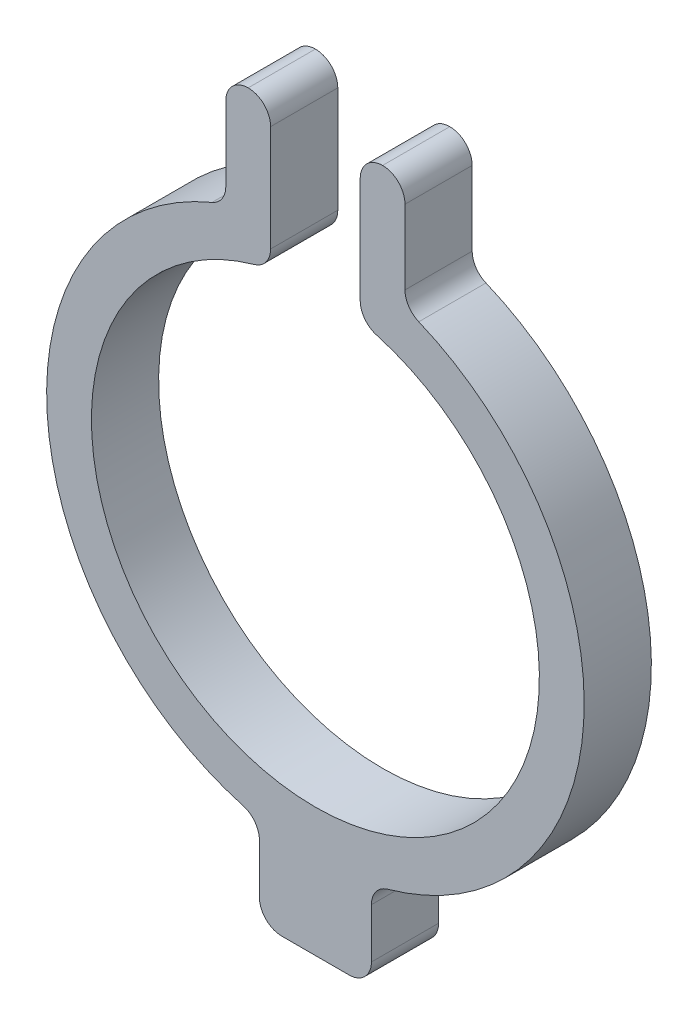
ISO-10303-21;
HEADER;
FILE_DESCRIPTION(('STEP AP214'),'2;1');
FILE_NAME('part.step','',(''),(''),'','','');
FILE_SCHEMA(('AUTOMOTIVE_DESIGN { 1 0 10303 214 1 1 1 1 }'));
ENDSEC;
DATA;
#1=APPLICATION_CONTEXT('core data for automotive mechanical design processes');
#2=APPLICATION_PROTOCOL_DEFINITION('international standard','automotive_design',2000,#1);
#3=PRODUCT_CONTEXT('',#1,'mechanical');
#4=PRODUCT('Part','Part','',(#3));
#5=PRODUCT_RELATED_PRODUCT_CATEGORY('part','',(#4));
#6=PRODUCT_DEFINITION_FORMATION('','',#4);
#7=PRODUCT_DEFINITION_CONTEXT('part definition',#1,'design');
#8=PRODUCT_DEFINITION('design','',#6,#7);
#9=PRODUCT_DEFINITION_SHAPE('','',#8);
#10=(LENGTH_UNIT() NAMED_UNIT(*) SI_UNIT(.MILLI.,.METRE.));
#11=(NAMED_UNIT(*) PLANE_ANGLE_UNIT() SI_UNIT($,.RADIAN.));
#12=(NAMED_UNIT(*) SI_UNIT($,.STERADIAN.) SOLID_ANGLE_UNIT());
#13=UNCERTAINTY_MEASURE_WITH_UNIT(LENGTH_MEASURE(1.E-05),#10,'distance_accuracy_value','');
#14=(GEOMETRIC_REPRESENTATION_CONTEXT(3) GLOBAL_UNCERTAINTY_ASSIGNED_CONTEXT((#13)) GLOBAL_UNIT_ASSIGNED_CONTEXT((#10,
#11,#12)) REPRESENTATION_CONTEXT('',''));
#15=CARTESIAN_POINT('',(0.,0.,0.));
#16=DIRECTION('',(0.,0.,1.));
#17=DIRECTION('',(1.,0.,0.));
#18=AXIS2_PLACEMENT_3D('',#15,#16,#17);
#19=CARTESIAN_POINT('',(5.00000000000001,0.,6.));
#20=DIRECTION('',(1.,0.,0.));
#21=DIRECTION('',(0.,1.,0.));
#22=AXIS2_PLACEMENT_3D('',#19,#20,#21);
#23=PLANE('',#22);
#24=DIRECTION('',(0.,-1.,0.));
#25=VECTOR('',#24,1.);
#26=CARTESIAN_POINT('',(5.00000000000001,0.,6.));
#27=LINE('',#26,#25);
#28=CARTESIAN_POINT('',(5.00000000000002,-25.0399680510978,6.));
#29=VERTEX_POINT('',#28);
#30=CARTESIAN_POINT('',(5.00000000000002,-29.473389188611,6.));
#31=VERTEX_POINT('',#30);
#32=EDGE_CURVE('E212',#29,#31,#27,.T.);
#33=ORIENTED_EDGE('',*,*,#32,.T.);
#34=DIRECTION('',(0.,0.,-1.));
#35=VECTOR('',#34,1.);
#36=CARTESIAN_POINT('',(5.00000000000002,-29.473389188611,0.));
#37=LINE('',#36,#35);
#38=CARTESIAN_POINT('',(5.00000000000002,-29.473389188611,0.));
#39=VERTEX_POINT('',#38);
#40=EDGE_CURVE('E260',#31,#39,#37,.T.);
#41=ORIENTED_EDGE('',*,*,#40,.T.);
#42=DIRECTION('',(0.,-1.,0.));
#43=VECTOR('',#42,1.);
#44=CARTESIAN_POINT('',(5.00000000000001,0.,0.));
#45=LINE('',#44,#43);
#46=CARTESIAN_POINT('',(5.00000000000002,-25.0399680510978,0.));
#47=VERTEX_POINT('',#46);
#48=EDGE_CURVE('E307',#47,#39,#45,.T.);
#49=ORIENTED_EDGE('',*,*,#48,.F.);
#50=DIRECTION('',(0.,0.,-1.));
#51=VECTOR('',#50,1.);
#52=CARTESIAN_POINT('',(5.00000000000002,-25.0399680510978,6.));
#53=LINE('',#52,#51);
#54=EDGE_CURVE('E258',#47,#29,#53,.F.);
#55=ORIENTED_EDGE('',*,*,#54,.T.);
#56=EDGE_LOOP('',(#33,#41,#49,#55));
#57=FACE_BOUND('',#56,.T.);
#58=ADVANCED_FACE('F35',(#57),#23,.T.);
#59=CARTESIAN_POINT('',(0.,0.,6.));
#60=DIRECTION('',(0.,0.,-1.));
#61=DIRECTION('',(-1.,0.,0.));
#62=AXIS2_PLACEMENT_3D('',#59,#60,#61);
#63=CYLINDRICAL_SURFACE('',#62,24.);
#64=CARTESIAN_POINT('',(0.,0.,6.));
#65=DIRECTION('',(0.,0.,1.));
#66=DIRECTION('',(1.,0.,0.));
#67=AXIS2_PLACEMENT_3D('',#64,#65,#66);
#68=CIRCLE('',#67,24.);
#69=CARTESIAN_POINT('',(6.46153846153848,-23.1138166625518,6.));
#70=VERTEX_POINT('',#69);
#71=CARTESIAN_POINT('',(9.23076923076922,22.1538461538462,6.));
#72=VERTEX_POINT('',#71);
#73=EDGE_CURVE('E216',#70,#72,#68,.T.);
#74=ORIENTED_EDGE('',*,*,#73,.F.);
#75=DIRECTION('',(0.,0.,-1.));
#76=VECTOR('',#75,1.);
#77=CARTESIAN_POINT('',(6.46153846153848,-23.1138166625518,6.));
#78=LINE('',#77,#76);
#79=CARTESIAN_POINT('',(6.46153846153848,-23.1138166625518,0.));
#80=VERTEX_POINT('',#79);
#81=EDGE_CURVE('E265',#70,#80,#78,.T.);
#82=ORIENTED_EDGE('',*,*,#81,.T.);
#83=CARTESIAN_POINT('',(0.,0.,0.));
#84=DIRECTION('',(0.,0.,1.));
#85=DIRECTION('',(1.,0.,0.));
#86=AXIS2_PLACEMENT_3D('',#83,#84,#85);
#87=CIRCLE('',#86,24.);
#88=CARTESIAN_POINT('',(9.23076923076922,22.1538461538462,0.));
#89=VERTEX_POINT('',#88);
#90=EDGE_CURVE('E311',#80,#89,#87,.T.);
#91=ORIENTED_EDGE('',*,*,#90,.T.);
#92=DIRECTION('',(0.,0.,-1.));
#93=VECTOR('',#92,1.);
#94=CARTESIAN_POINT('',(9.23076923076922,22.1538461538462,6.));
#95=LINE('',#94,#93);
#96=EDGE_CURVE('E263',#89,#72,#95,.F.);
#97=ORIENTED_EDGE('',*,*,#96,.T.);
#98=EDGE_LOOP('',(#74,#82,#91,#97));
#99=FACE_BOUND('',#98,.T.);
#100=ADVANCED_FACE('F379',(#99),#63,.T.);
#101=CARTESIAN_POINT('',(8.,0.,6.));
#102=DIRECTION('',(-1.,0.,0.));
#103=DIRECTION('',(0.,-1.,0.));
#104=AXIS2_PLACEMENT_3D('',#101,#102,#103);
#105=PLANE('',#104);
#106=DIRECTION('',(0.,1.,0.));
#107=VECTOR('',#106,1.);
#108=CARTESIAN_POINT('',(8.,0.,6.));
#109=LINE('',#108,#107);
#110=CARTESIAN_POINT('',(7.99999999999999,24.,6.));
#111=VERTEX_POINT('',#110);
#112=CARTESIAN_POINT('',(7.99999999999999,30.6274169979695,6.));
#113=VERTEX_POINT('',#112);
#114=EDGE_CURVE('E440',#111,#113,#109,.T.);
#115=ORIENTED_EDGE('',*,*,#114,.F.);
#116=DIRECTION('',(0.,0.,1.));
#117=VECTOR('',#116,1.);
#118=CARTESIAN_POINT('',(7.99999999999999,24.,0.));
#119=LINE('',#118,#117);
#120=CARTESIAN_POINT('',(7.99999999999999,24.,0.));
#121=VERTEX_POINT('',#120);
#122=EDGE_CURVE('E271',#111,#121,#119,.F.);
#123=ORIENTED_EDGE('',*,*,#122,.T.);
#124=DIRECTION('',(0.,1.,0.));
#125=VECTOR('',#124,1.);
#126=CARTESIAN_POINT('',(8.,0.,0.));
#127=LINE('',#126,#125);
#128=CARTESIAN_POINT('',(7.99999999999999,30.6274169979695,0.));
#129=VERTEX_POINT('',#128);
#130=EDGE_CURVE('E347',#121,#129,#127,.T.);
#131=ORIENTED_EDGE('',*,*,#130,.T.);
#132=DIRECTION('',(0.,0.,-1.));
#133=VECTOR('',#132,1.);
#134=CARTESIAN_POINT('',(7.99999999999999,30.6274169979695,6.));
#135=LINE('',#134,#133);
#136=EDGE_CURVE('E268',#129,#113,#135,.F.);
#137=ORIENTED_EDGE('',*,*,#136,.T.);
#138=EDGE_LOOP('',(#115,#123,#131,#137));
#139=FACE_BOUND('',#138,.T.);
#140=ADVANCED_FACE('F385',(#139),#105,.F.);
#141=CARTESIAN_POINT('',(4.00000000000001,0.,6.));
#142=DIRECTION('',(-1.,0.,0.));
#143=DIRECTION('',(0.,-1.,0.));
#144=AXIS2_PLACEMENT_3D('',#141,#142,#143);
#145=PLANE('',#144);
#146=DIRECTION('',(0.,1.,0.));
#147=VECTOR('',#146,1.);
#148=CARTESIAN_POINT('',(4.00000000000001,0.,6.));
#149=LINE('',#148,#147);
#150=CARTESIAN_POINT('',(4.,21.1660104885167,6.));
#151=VERTEX_POINT('',#150);
#152=CARTESIAN_POINT('',(3.99999999999999,30.6274169979695,6.));
#153=VERTEX_POINT('',#152);
#154=EDGE_CURVE('E435',#151,#153,#149,.T.);
#155=ORIENTED_EDGE('',*,*,#154,.T.);
#156=DIRECTION('',(0.,0.,-1.));
#157=VECTOR('',#156,1.);
#158=CARTESIAN_POINT('',(3.99999999999999,30.6274169979695,6.));
#159=LINE('',#158,#157);
#160=CARTESIAN_POINT('',(3.99999999999999,30.6274169979695,0.));
#161=VERTEX_POINT('',#160);
#162=EDGE_CURVE('E276',#153,#161,#159,.T.);
#163=ORIENTED_EDGE('',*,*,#162,.T.);
#164=DIRECTION('',(0.,1.,0.));
#165=VECTOR('',#164,1.);
#166=CARTESIAN_POINT('',(4.00000000000001,0.,0.));
#167=LINE('',#166,#165);
#168=CARTESIAN_POINT('',(4.,21.1660104885167,0.));
#169=VERTEX_POINT('',#168);
#170=EDGE_CURVE('E350',#169,#161,#167,.T.);
#171=ORIENTED_EDGE('',*,*,#170,.F.);
#172=DIRECTION('',(0.,0.,-1.));
#173=VECTOR('',#172,1.);
#174=CARTESIAN_POINT('',(4.,21.1660104885167,6.));
#175=LINE('',#174,#173);
#176=EDGE_CURVE('E274',#169,#151,#175,.F.);
#177=ORIENTED_EDGE('',*,*,#176,.T.);
#178=EDGE_LOOP('',(#155,#163,#171,#177));
#179=FACE_BOUND('',#178,.T.);
#180=ADVANCED_FACE('F463',(#179),#145,.T.);
#181=CARTESIAN_POINT('',(0.,0.,6.));
#182=DIRECTION('',(0.,0.,-1.));
#183=DIRECTION('',(-1.,0.,0.));
#184=AXIS2_PLACEMENT_3D('',#181,#182,#183);
#185=CYLINDRICAL_SURFACE('',#184,20.);
#186=CARTESIAN_POINT('',(0.,0.,0.));
#187=DIRECTION('',(0.,0.,1.));
#188=DIRECTION('',(1.,0.,0.));
#189=AXIS2_PLACEMENT_3D('',#186,#187,#188);
#190=CIRCLE('',#189,20.);
#191=CARTESIAN_POINT('',(-5.45454545454546,19.2418277168334,0.));
#192=VERTEX_POINT('',#191);
#193=CARTESIAN_POINT('',(5.45454545454545,19.2418277168334,0.));
#194=VERTEX_POINT('',#193);
#195=EDGE_CURVE('E353',#192,#194,#190,.T.);
#196=ORIENTED_EDGE('',*,*,#195,.F.);
#197=DIRECTION('',(0.,0.,-1.));
#198=VECTOR('',#197,1.);
#199=CARTESIAN_POINT('',(-5.45454545454546,19.2418277168334,6.));
#200=LINE('',#199,#198);
#201=CARTESIAN_POINT('',(-5.45454545454546,19.2418277168334,6.));
#202=VERTEX_POINT('',#201);
#203=EDGE_CURVE('E291',#192,#202,#200,.F.);
#204=ORIENTED_EDGE('',*,*,#203,.T.);
#205=CARTESIAN_POINT('',(0.,0.,6.));
#206=DIRECTION('',(0.,0.,1.));
#207=DIRECTION('',(1.,0.,0.));
#208=AXIS2_PLACEMENT_3D('',#205,#206,#207);
#209=CIRCLE('',#208,20.);
#210=CARTESIAN_POINT('',(5.45454545454545,19.2418277168334,6.));
#211=VERTEX_POINT('',#210);
#212=EDGE_CURVE('E339',#202,#211,#209,.T.);
#213=ORIENTED_EDGE('',*,*,#212,.T.);
#214=DIRECTION('',(0.,0.,-1.));
#215=VECTOR('',#214,1.);
#216=CARTESIAN_POINT('',(5.45454545454545,19.2418277168334,6.));
#217=LINE('',#216,#215);
#218=EDGE_CURVE('E288',#211,#194,#217,.T.);
#219=ORIENTED_EDGE('',*,*,#218,.T.);
#220=EDGE_LOOP('',(#196,#204,#213,#219));
#221=FACE_BOUND('',#220,.T.);
#222=ADVANCED_FACE('F438',(#221),#185,.F.);
#223=CARTESIAN_POINT('',(-4.00000000000001,0.,6.));
#224=DIRECTION('',(-1.,0.,0.));
#225=DIRECTION('',(0.,-1.,0.));
#226=AXIS2_PLACEMENT_3D('',#223,#224,#225);
#227=PLANE('',#226);
#228=DIRECTION('',(0.,1.,0.));
#229=VECTOR('',#228,1.);
#230=CARTESIAN_POINT('',(-4.00000000000001,0.,0.));
#231=LINE('',#230,#229);
#232=CARTESIAN_POINT('',(-4.,21.1660104885167,0.));
#233=VERTEX_POINT('',#232);
#234=CARTESIAN_POINT('',(-4.,30.6274169979695,0.));
#235=VERTEX_POINT('',#234);
#236=EDGE_CURVE('E356',#233,#235,#231,.T.);
#237=ORIENTED_EDGE('',*,*,#236,.T.);
#238=DIRECTION('',(0.,0.,-1.));
#239=VECTOR('',#238,1.);
#240=CARTESIAN_POINT('',(-4.,30.6274169979695,6.));
#241=LINE('',#240,#239);
#242=CARTESIAN_POINT('',(-4.,30.6274169979695,6.));
#243=VERTEX_POINT('',#242);
#244=EDGE_CURVE('E281',#235,#243,#241,.F.);
#245=ORIENTED_EDGE('',*,*,#244,.T.);
#246=DIRECTION('',(0.,1.,0.));
#247=VECTOR('',#246,1.);
#248=CARTESIAN_POINT('',(-4.00000000000001,0.,6.));
#249=LINE('',#248,#247);
#250=CARTESIAN_POINT('',(-4.,21.1660104885167,6.));
#251=VERTEX_POINT('',#250);
#252=EDGE_CURVE('E335',#251,#243,#249,.T.);
#253=ORIENTED_EDGE('',*,*,#252,.F.);
#254=DIRECTION('',(0.,0.,1.));
#255=VECTOR('',#254,1.);
#256=CARTESIAN_POINT('',(-4.,21.1660104885167,0.));
#257=LINE('',#256,#255);
#258=EDGE_CURVE('E278',#251,#233,#257,.F.);
#259=ORIENTED_EDGE('',*,*,#258,.T.);
#260=EDGE_LOOP('',(#237,#245,#253,#259));
#261=FACE_BOUND('',#260,.T.);
#262=ADVANCED_FACE('F468',(#261),#227,.F.);
#263=CARTESIAN_POINT('',(-8.00000000000002,0.,6.));
#264=DIRECTION('',(-1.,0.,0.));
#265=DIRECTION('',(0.,-1.,0.));
#266=AXIS2_PLACEMENT_3D('',#263,#264,#265);
#267=PLANE('',#266);
#268=DIRECTION('',(0.,1.,0.));
#269=VECTOR('',#268,1.);
#270=CARTESIAN_POINT('',(-8.00000000000002,0.,6.));
#271=LINE('',#270,#269);
#272=CARTESIAN_POINT('',(-8.00000000000001,24.,6.));
#273=VERTEX_POINT('',#272);
#274=CARTESIAN_POINT('',(-8.00000000000001,30.6274169979695,6.));
#275=VERTEX_POINT('',#274);
#276=EDGE_CURVE('E327',#273,#275,#271,.T.);
#277=ORIENTED_EDGE('',*,*,#276,.T.);
#278=DIRECTION('',(0.,0.,-1.));
#279=VECTOR('',#278,1.);
#280=CARTESIAN_POINT('',(-8.00000000000001,30.6274169979695,6.));
#281=LINE('',#280,#279);
#282=CARTESIAN_POINT('',(-8.00000000000001,30.6274169979695,0.));
#283=VERTEX_POINT('',#282);
#284=EDGE_CURVE('E286',#275,#283,#281,.T.);
#285=ORIENTED_EDGE('',*,*,#284,.T.);
#286=DIRECTION('',(0.,1.,0.));
#287=VECTOR('',#286,1.);
#288=CARTESIAN_POINT('',(-8.00000000000002,0.,0.));
#289=LINE('',#288,#287);
#290=CARTESIAN_POINT('',(-8.00000000000001,24.,0.));
#291=VERTEX_POINT('',#290);
#292=EDGE_CURVE('E359',#291,#283,#289,.T.);
#293=ORIENTED_EDGE('',*,*,#292,.F.);
#294=DIRECTION('',(0.,0.,-1.));
#295=VECTOR('',#294,1.);
#296=CARTESIAN_POINT('',(-8.00000000000001,24.,6.));
#297=LINE('',#296,#295);
#298=EDGE_CURVE('E284',#291,#273,#297,.F.);
#299=ORIENTED_EDGE('',*,*,#298,.T.);
#300=EDGE_LOOP('',(#277,#285,#293,#299));
#301=FACE_BOUND('',#300,.T.);
#302=ADVANCED_FACE('F330',(#301),#267,.T.);
#303=CARTESIAN_POINT('',(0.,0.,6.));
#304=DIRECTION('',(0.,0.,-1.));
#305=DIRECTION('',(-1.,0.,0.));
#306=AXIS2_PLACEMENT_3D('',#303,#304,#305);
#307=CYLINDRICAL_SURFACE('',#306,24.);
#308=CARTESIAN_POINT('',(0.,0.,0.));
#309=DIRECTION('',(0.,0.,1.));
#310=DIRECTION('',(1.,0.,0.));
#311=AXIS2_PLACEMENT_3D('',#308,#309,#310);
#312=CIRCLE('',#311,24.);
#313=CARTESIAN_POINT('',(-9.23076923076924,22.1538461538461,0.));
#314=VERTEX_POINT('',#313);
#315=CARTESIAN_POINT('',(-6.46153846153847,-23.1138166625518,0.));
#316=VERTEX_POINT('',#315);
#317=EDGE_CURVE('E218',#314,#316,#312,.T.);
#318=ORIENTED_EDGE('',*,*,#317,.T.);
#319=DIRECTION('',(0.,0.,-1.));
#320=VECTOR('',#319,1.);
#321=CARTESIAN_POINT('',(-6.46153846153847,-23.1138166625518,6.));
#322=LINE('',#321,#320);
#323=CARTESIAN_POINT('',(-6.46153846153847,-23.1138166625518,6.));
#324=VERTEX_POINT('',#323);
#325=EDGE_CURVE('E52',#316,#324,#322,.F.);
#326=ORIENTED_EDGE('',*,*,#325,.T.);
#327=CARTESIAN_POINT('',(0.,0.,6.));
#328=DIRECTION('',(0.,0.,1.));
#329=DIRECTION('',(1.,0.,0.));
#330=AXIS2_PLACEMENT_3D('',#327,#328,#329);
#331=CIRCLE('',#330,24.);
#332=CARTESIAN_POINT('',(-9.23076923076924,22.1538461538461,6.));
#333=VERTEX_POINT('',#332);
#334=EDGE_CURVE('E334',#333,#324,#331,.T.);
#335=ORIENTED_EDGE('',*,*,#334,.F.);
#336=DIRECTION('',(0.,0.,-1.));
#337=VECTOR('',#336,1.);
#338=CARTESIAN_POINT('',(-9.23076923076924,22.1538461538462,6.));
#339=LINE('',#338,#337);
#340=EDGE_CURVE('E254',#333,#314,#339,.T.);
#341=ORIENTED_EDGE('',*,*,#340,.T.);
#342=EDGE_LOOP('',(#318,#326,#335,#341));
#343=FACE_BOUND('',#342,.T.);
#344=ADVANCED_FACE('F361',(#343),#307,.T.);
#345=CARTESIAN_POINT('',(-5.00000000000001,0.,6.));
#346=DIRECTION('',(1.,0.,0.));
#347=DIRECTION('',(0.,1.,0.));
#348=AXIS2_PLACEMENT_3D('',#345,#346,#347);
#349=PLANE('',#348);
#350=DIRECTION('',(0.,-1.,0.));
#351=VECTOR('',#350,1.);
#352=CARTESIAN_POINT('',(-5.00000000000001,0.,0.));
#353=LINE('',#352,#351);
#354=CARTESIAN_POINT('',(-5.00000000000001,-25.0399680510978,0.));
#355=VERTEX_POINT('',#354);
#356=CARTESIAN_POINT('',(-5.00000000000001,-29.473389188611,0.));
#357=VERTEX_POINT('',#356);
#358=EDGE_CURVE('E213',#355,#357,#353,.T.);
#359=ORIENTED_EDGE('',*,*,#358,.T.);
#360=DIRECTION('',(0.,0.,-1.));
#361=VECTOR('',#360,1.);
#362=CARTESIAN_POINT('',(-5.00000000000001,-29.473389188611,6.));
#363=LINE('',#362,#361);
#364=CARTESIAN_POINT('',(-5.00000000000001,-29.473389188611,6.));
#365=VERTEX_POINT('',#364);
#366=EDGE_CURVE('E191',#357,#365,#363,.F.);
#367=ORIENTED_EDGE('',*,*,#366,.T.);
#368=DIRECTION('',(0.,-1.,0.));
#369=VECTOR('',#368,1.);
#370=CARTESIAN_POINT('',(-5.00000000000001,0.,6.));
#371=LINE('',#370,#369);
#372=CARTESIAN_POINT('',(-5.00000000000001,-25.0399680510978,6.));
#373=VERTEX_POINT('',#372);
#374=EDGE_CURVE('E337',#373,#365,#371,.T.);
#375=ORIENTED_EDGE('',*,*,#374,.F.);
#376=DIRECTION('',(0.,0.,1.));
#377=VECTOR('',#376,1.);
#378=CARTESIAN_POINT('',(-5.00000000000001,-25.0399680510978,0.));
#379=LINE('',#378,#377);
#380=EDGE_CURVE('E196',#373,#355,#379,.F.);
#381=ORIENTED_EDGE('',*,*,#380,.T.);
#382=EDGE_LOOP('',(#359,#367,#375,#381));
#383=FACE_BOUND('',#382,.T.);
#384=ADVANCED_FACE('F369',(#383),#349,.F.);
#385=CARTESIAN_POINT('',(0.,-31.473389188611,6.));
#386=DIRECTION('',(0.,1.,0.));
#387=DIRECTION('',(0.,0.,1.));
#388=AXIS2_PLACEMENT_3D('',#385,#386,#387);
#389=PLANE('',#388);
#390=DIRECTION('',(1.,0.,0.));
#391=VECTOR('',#390,1.);
#392=CARTESIAN_POINT('',(0.,-31.473389188611,6.));
#393=LINE('',#392,#391);
#394=CARTESIAN_POINT('',(-3.00000000000001,-31.473389188611,6.));
#395=VERTEX_POINT('',#394);
#396=CARTESIAN_POINT('',(3.00000000000002,-31.473389188611,6.));
#397=VERTEX_POINT('',#396);
#398=EDGE_CURVE('E206',#395,#397,#393,.T.);
#399=ORIENTED_EDGE('',*,*,#398,.F.);
#400=DIRECTION('',(0.,0.,-1.));
#401=VECTOR('',#400,1.);
#402=CARTESIAN_POINT('',(-3.00000000000001,-31.473389188611,6.));
#403=LINE('',#402,#401);
#404=CARTESIAN_POINT('',(-3.00000000000001,-31.473389188611,0.));
#405=VERTEX_POINT('',#404);
#406=EDGE_CURVE('E190',#395,#405,#403,.T.);
#407=ORIENTED_EDGE('',*,*,#406,.T.);
#408=DIRECTION('',(1.,0.,0.));
#409=VECTOR('',#408,1.);
#410=CARTESIAN_POINT('',(0.,-31.473389188611,0.));
#411=LINE('',#410,#409);
#412=CARTESIAN_POINT('',(3.00000000000002,-31.473389188611,0.));
#413=VERTEX_POINT('',#412);
#414=EDGE_CURVE('E203',#405,#413,#411,.T.);
#415=ORIENTED_EDGE('',*,*,#414,.T.);
#416=DIRECTION('',(0.,0.,-1.));
#417=VECTOR('',#416,1.);
#418=CARTESIAN_POINT('',(3.00000000000002,-31.473389188611,6.));
#419=LINE('',#418,#417);
#420=EDGE_CURVE('E208',#413,#397,#419,.F.);
#421=ORIENTED_EDGE('',*,*,#420,.T.);
#422=EDGE_LOOP('',(#399,#407,#415,#421));
#423=FACE_BOUND('',#422,.T.);
#424=ADVANCED_FACE('F202',(#423),#389,.F.);
#425=CARTESIAN_POINT('',(0.,0.,6.));
#426=DIRECTION('',(0.,0.,1.));
#427=DIRECTION('',(1.,0.,0.));
#428=AXIS2_PLACEMENT_3D('',#425,#426,#427);
#429=PLANE('',#428);
#430=ORIENTED_EDGE('',*,*,#374,.T.);
#431=CARTESIAN_POINT('',(-3.00000000000001,-29.473389188611,6.));
#432=DIRECTION('',(0.,0.,1.));
#433=DIRECTION('',(1.,0.,0.));
#434=AXIS2_PLACEMENT_3D('',#431,#432,#433);
#435=CIRCLE('',#434,2.);
#436=EDGE_CURVE('E252',#365,#395,#435,.T.);
#437=ORIENTED_EDGE('',*,*,#436,.T.);
#438=ORIENTED_EDGE('',*,*,#398,.T.);
#439=CARTESIAN_POINT('',(3.00000000000002,-29.473389188611,6.));
#440=DIRECTION('',(0.,0.,1.));
#441=DIRECTION('',(1.,0.,0.));
#442=AXIS2_PLACEMENT_3D('',#439,#440,#441);
#443=CIRCLE('',#442,2.);
#444=EDGE_CURVE('E250',#397,#31,#443,.T.);
#445=ORIENTED_EDGE('',*,*,#444,.T.);
#446=ORIENTED_EDGE('',*,*,#32,.F.);
#447=CARTESIAN_POINT('',(7.00000000000002,-25.0399680510978,6.));
#448=DIRECTION('',(0.,0.,1.));
#449=DIRECTION('',(1.,0.,0.));
#450=AXIS2_PLACEMENT_3D('',#447,#448,#449);
#451=CIRCLE('',#450,2.);
#452=EDGE_CURVE('E299',#29,#70,#451,.F.);
#453=ORIENTED_EDGE('',*,*,#452,.T.);
#454=ORIENTED_EDGE('',*,*,#73,.T.);
#455=CARTESIAN_POINT('',(9.99999999999999,24.,6.));
#456=DIRECTION('',(0.,0.,1.));
#457=DIRECTION('',(1.,0.,0.));
#458=AXIS2_PLACEMENT_3D('',#455,#456,#457);
#459=CIRCLE('',#458,2.);
#460=EDGE_CURVE('E303',#72,#111,#459,.F.);
#461=ORIENTED_EDGE('',*,*,#460,.T.);
#462=ORIENTED_EDGE('',*,*,#114,.T.);
#463=CARTESIAN_POINT('',(5.99999999999999,30.6274169979695,6.));
#464=DIRECTION('',(0.,0.,1.));
#465=DIRECTION('',(1.,0.,0.));
#466=AXIS2_PLACEMENT_3D('',#463,#464,#465);
#467=CIRCLE('',#466,2.);
#468=CARTESIAN_POINT('',(5.99999999999999,32.6274169979695,6.));
#469=VERTEX_POINT('',#468);
#470=EDGE_CURVE('E248',#113,#469,#467,.T.);
#471=ORIENTED_EDGE('',*,*,#470,.T.);
#472=CARTESIAN_POINT('',(5.99999999999999,30.6274169979695,6.));
#473=DIRECTION('',(0.,0.,1.));
#474=DIRECTION('',(1.,0.,0.));
#475=AXIS2_PLACEMENT_3D('',#472,#473,#474);
#476=CIRCLE('',#475,2.);
#477=EDGE_CURVE('E246',#469,#153,#476,.T.);
#478=ORIENTED_EDGE('',*,*,#477,.T.);
#479=ORIENTED_EDGE('',*,*,#154,.F.);
#480=CARTESIAN_POINT('',(6.,21.1660104885167,6.));
#481=DIRECTION('',(0.,0.,1.));
#482=DIRECTION('',(1.,0.,0.));
#483=AXIS2_PLACEMENT_3D('',#480,#481,#482);
#484=CIRCLE('',#483,2.);
#485=EDGE_CURVE('E238',#151,#211,#484,.T.);
#486=ORIENTED_EDGE('',*,*,#485,.T.);
#487=ORIENTED_EDGE('',*,*,#212,.F.);
#488=CARTESIAN_POINT('',(-6.,21.1660104885167,6.));
#489=DIRECTION('',(0.,0.,1.));
#490=DIRECTION('',(1.,0.,0.));
#491=AXIS2_PLACEMENT_3D('',#488,#489,#490);
#492=CIRCLE('',#491,2.);
#493=EDGE_CURVE('E240',#202,#251,#492,.T.);
#494=ORIENTED_EDGE('',*,*,#493,.T.);
#495=ORIENTED_EDGE('',*,*,#252,.T.);
#496=CARTESIAN_POINT('',(-6.,30.6274169979695,6.));
#497=DIRECTION('',(0.,0.,1.));
#498=DIRECTION('',(1.,0.,0.));
#499=AXIS2_PLACEMENT_3D('',#496,#497,#498);
#500=CIRCLE('',#499,2.);
#501=CARTESIAN_POINT('',(-6.00000000000001,32.6274169979695,6.));
#502=VERTEX_POINT('',#501);
#503=EDGE_CURVE('E244',#243,#502,#500,.T.);
#504=ORIENTED_EDGE('',*,*,#503,.T.);
#505=CARTESIAN_POINT('',(-6.00000000000001,30.6274169979695,6.));
#506=DIRECTION('',(0.,0.,1.));
#507=DIRECTION('',(1.,0.,0.));
#508=AXIS2_PLACEMENT_3D('',#505,#506,#507);
#509=CIRCLE('',#508,2.);
#510=EDGE_CURVE('E242',#502,#275,#509,.T.);
#511=ORIENTED_EDGE('',*,*,#510,.T.);
#512=ORIENTED_EDGE('',*,*,#276,.F.);
#513=CARTESIAN_POINT('',(-10.,24.,6.));
#514=DIRECTION('',(0.,0.,1.));
#515=DIRECTION('',(1.,0.,0.));
#516=AXIS2_PLACEMENT_3D('',#513,#514,#515);
#517=CIRCLE('',#516,2.);
#518=EDGE_CURVE('E11',#273,#333,#517,.F.);
#519=ORIENTED_EDGE('',*,*,#518,.T.);
#520=ORIENTED_EDGE('',*,*,#334,.T.);
#521=CARTESIAN_POINT('',(-7.00000000000001,-25.0399680510978,6.));
#522=DIRECTION('',(0.,0.,1.));
#523=DIRECTION('',(1.,0.,0.));
#524=AXIS2_PLACEMENT_3D('',#521,#522,#523);
#525=CIRCLE('',#524,2.);
#526=EDGE_CURVE('E295',#324,#373,#525,.F.);
#527=ORIENTED_EDGE('',*,*,#526,.T.);
#528=EDGE_LOOP('',(#430,#437,#438,#445,#446,#453,#454,#461,#462,#471,#478,#479,#486,#487,#494,
#495,#504,#511,#512,#519,#520,#527));
#529=FACE_BOUND('',#528,.T.);
#530=ADVANCED_FACE('F326',(#529),#429,.T.);
#531=CARTESIAN_POINT('',(0.,0.,0.));
#532=DIRECTION('',(0.,0.,1.));
#533=DIRECTION('',(1.,0.,0.));
#534=AXIS2_PLACEMENT_3D('',#531,#532,#533);
#535=PLANE('',#534);
#536=ORIENTED_EDGE('',*,*,#414,.F.);
#537=CARTESIAN_POINT('',(-3.00000000000001,-29.473389188611,0.));
#538=DIRECTION('',(0.,0.,1.));
#539=DIRECTION('',(1.,0.,0.));
#540=AXIS2_PLACEMENT_3D('',#537,#538,#539);
#541=CIRCLE('',#540,2.);
#542=EDGE_CURVE('E186',#405,#357,#541,.F.);
#543=ORIENTED_EDGE('',*,*,#542,.T.);
#544=ORIENTED_EDGE('',*,*,#358,.F.);
#545=CARTESIAN_POINT('',(-7.00000000000001,-25.0399680510978,0.));
#546=DIRECTION('',(0.,0.,1.));
#547=DIRECTION('',(1.,0.,0.));
#548=AXIS2_PLACEMENT_3D('',#545,#546,#547);
#549=CIRCLE('',#548,2.);
#550=EDGE_CURVE('E293',#355,#316,#549,.T.);
#551=ORIENTED_EDGE('',*,*,#550,.T.);
#552=ORIENTED_EDGE('',*,*,#317,.F.);
#553=CARTESIAN_POINT('',(-10.,24.,0.));
#554=DIRECTION('',(0.,0.,1.));
#555=DIRECTION('',(1.,0.,0.));
#556=AXIS2_PLACEMENT_3D('',#553,#554,#555);
#557=CIRCLE('',#556,2.);
#558=EDGE_CURVE('E44',#314,#291,#557,.T.);
#559=ORIENTED_EDGE('',*,*,#558,.T.);
#560=ORIENTED_EDGE('',*,*,#292,.T.);
#561=CARTESIAN_POINT('',(-6.00000000000001,30.6274169979695,0.));
#562=DIRECTION('',(0.,0.,1.));
#563=DIRECTION('',(1.,0.,0.));
#564=AXIS2_PLACEMENT_3D('',#561,#562,#563);
#565=CIRCLE('',#564,2.);
#566=CARTESIAN_POINT('',(-6.00000000000001,32.6274169979695,0.));
#567=VERTEX_POINT('',#566);
#568=EDGE_CURVE('E226',#283,#567,#565,.F.);
#569=ORIENTED_EDGE('',*,*,#568,.T.);
#570=CARTESIAN_POINT('',(-6.,30.6274169979695,0.));
#571=DIRECTION('',(0.,0.,1.));
#572=DIRECTION('',(1.,0.,0.));
#573=AXIS2_PLACEMENT_3D('',#570,#571,#572);
#574=CIRCLE('',#573,2.);
#575=EDGE_CURVE('E228',#567,#235,#574,.F.);
#576=ORIENTED_EDGE('',*,*,#575,.T.);
#577=ORIENTED_EDGE('',*,*,#236,.F.);
#578=CARTESIAN_POINT('',(-6.,21.1660104885167,0.));
#579=DIRECTION('',(0.,0.,1.));
#580=DIRECTION('',(1.,0.,0.));
#581=AXIS2_PLACEMENT_3D('',#578,#579,#580);
#582=CIRCLE('',#581,2.);
#583=EDGE_CURVE('E224',#233,#192,#582,.F.);
#584=ORIENTED_EDGE('',*,*,#583,.T.);
#585=ORIENTED_EDGE('',*,*,#195,.T.);
#586=CARTESIAN_POINT('',(6.,21.1660104885167,0.));
#587=DIRECTION('',(0.,0.,1.));
#588=DIRECTION('',(1.,0.,0.));
#589=AXIS2_PLACEMENT_3D('',#586,#587,#588);
#590=CIRCLE('',#589,2.);
#591=EDGE_CURVE('E207',#194,#169,#590,.F.);
#592=ORIENTED_EDGE('',*,*,#591,.T.);
#593=ORIENTED_EDGE('',*,*,#170,.T.);
#594=CARTESIAN_POINT('',(5.99999999999999,30.6274169979695,0.));
#595=DIRECTION('',(0.,0.,1.));
#596=DIRECTION('',(1.,0.,0.));
#597=AXIS2_PLACEMENT_3D('',#594,#595,#596);
#598=CIRCLE('',#597,2.);
#599=CARTESIAN_POINT('',(5.99999999999999,32.6274169979695,0.));
#600=VERTEX_POINT('',#599);
#601=EDGE_CURVE('E230',#161,#600,#598,.F.);
#602=ORIENTED_EDGE('',*,*,#601,.T.);
#603=CARTESIAN_POINT('',(5.99999999999999,30.6274169979695,0.));
#604=DIRECTION('',(0.,0.,1.));
#605=DIRECTION('',(1.,0.,0.));
#606=AXIS2_PLACEMENT_3D('',#603,#604,#605);
#607=CIRCLE('',#606,2.);
#608=EDGE_CURVE('E232',#600,#129,#607,.F.);
#609=ORIENTED_EDGE('',*,*,#608,.T.);
#610=ORIENTED_EDGE('',*,*,#130,.F.);
#611=CARTESIAN_POINT('',(9.99999999999999,24.,0.));
#612=DIRECTION('',(0.,0.,1.));
#613=DIRECTION('',(1.,0.,0.));
#614=AXIS2_PLACEMENT_3D('',#611,#612,#613);
#615=CIRCLE('',#614,2.);
#616=EDGE_CURVE('E301',#121,#89,#615,.T.);
#617=ORIENTED_EDGE('',*,*,#616,.T.);
#618=ORIENTED_EDGE('',*,*,#90,.F.);
#619=CARTESIAN_POINT('',(7.00000000000002,-25.0399680510978,0.));
#620=DIRECTION('',(0.,0.,1.));
#621=DIRECTION('',(1.,0.,0.));
#622=AXIS2_PLACEMENT_3D('',#619,#620,#621);
#623=CIRCLE('',#622,2.);
#624=EDGE_CURVE('E297',#80,#47,#623,.T.);
#625=ORIENTED_EDGE('',*,*,#624,.T.);
#626=ORIENTED_EDGE('',*,*,#48,.T.);
#627=CARTESIAN_POINT('',(3.00000000000002,-29.473389188611,0.));
#628=DIRECTION('',(0.,0.,1.));
#629=DIRECTION('',(1.,0.,0.));
#630=AXIS2_PLACEMENT_3D('',#627,#628,#629);
#631=CIRCLE('',#630,2.);
#632=EDGE_CURVE('E197',#39,#413,#631,.F.);
#633=ORIENTED_EDGE('',*,*,#632,.T.);
#634=EDGE_LOOP('',(#536,#543,#544,#551,#552,#559,#560,#569,#576,#577,#584,#585,#592,#593,#602,
#609,#610,#617,#618,#625,#626,#633));
#635=FACE_BOUND('',#634,.T.);
#636=ADVANCED_FACE('F210',(#635),#535,.F.);
#637=CARTESIAN_POINT('',(-3.00000000000001,-29.473389188611,6.));
#638=DIRECTION('',(0.,0.,-1.));
#639=DIRECTION('',(-1.,0.,0.));
#640=AXIS2_PLACEMENT_3D('',#637,#638,#639);
#641=CYLINDRICAL_SURFACE('',#640,2.);
#642=ORIENTED_EDGE('',*,*,#436,.F.);
#643=ORIENTED_EDGE('',*,*,#366,.F.);
#644=ORIENTED_EDGE('',*,*,#542,.F.);
#645=ORIENTED_EDGE('',*,*,#406,.F.);
#646=EDGE_LOOP('',(#642,#643,#644,#645));
#647=FACE_BOUND('',#646,.T.);
#648=ADVANCED_FACE('F189',(#647),#641,.T.);
#649=CARTESIAN_POINT('',(-7.00000000000001,-25.0399680510978,6.));
#650=DIRECTION('',(0.,0.,-1.));
#651=DIRECTION('',(-1.,0.,0.));
#652=AXIS2_PLACEMENT_3D('',#649,#650,#651);
#653=CYLINDRICAL_SURFACE('',#652,2.);
#654=ORIENTED_EDGE('',*,*,#526,.F.);
#655=ORIENTED_EDGE('',*,*,#325,.F.);
#656=ORIENTED_EDGE('',*,*,#550,.F.);
#657=ORIENTED_EDGE('',*,*,#380,.F.);
#658=EDGE_LOOP('',(#654,#655,#656,#657));
#659=FACE_BOUND('',#658,.T.);
#660=ADVANCED_FACE('F365',(#659),#653,.F.);
#661=CARTESIAN_POINT('',(3.00000000000002,-29.473389188611,6.));
#662=DIRECTION('',(0.,0.,1.));
#663=DIRECTION('',(1.,0.,0.));
#664=AXIS2_PLACEMENT_3D('',#661,#662,#663);
#665=CYLINDRICAL_SURFACE('',#664,2.);
#666=ORIENTED_EDGE('',*,*,#444,.F.);
#667=ORIENTED_EDGE('',*,*,#420,.F.);
#668=ORIENTED_EDGE('',*,*,#632,.F.);
#669=ORIENTED_EDGE('',*,*,#40,.F.);
#670=EDGE_LOOP('',(#666,#667,#668,#669));
#671=FACE_BOUND('',#670,.T.);
#672=ADVANCED_FACE('F394',(#671),#665,.T.);
#673=CARTESIAN_POINT('',(7.00000000000002,-25.0399680510978,6.));
#674=DIRECTION('',(0.,0.,-1.));
#675=DIRECTION('',(-1.,0.,0.));
#676=AXIS2_PLACEMENT_3D('',#673,#674,#675);
#677=CYLINDRICAL_SURFACE('',#676,2.);
#678=ORIENTED_EDGE('',*,*,#452,.F.);
#679=ORIENTED_EDGE('',*,*,#54,.F.);
#680=ORIENTED_EDGE('',*,*,#624,.F.);
#681=ORIENTED_EDGE('',*,*,#81,.F.);
#682=EDGE_LOOP('',(#678,#679,#680,#681));
#683=FACE_BOUND('',#682,.T.);
#684=ADVANCED_FACE('F397',(#683),#677,.F.);
#685=CARTESIAN_POINT('',(9.99999999999999,24.,6.));
#686=DIRECTION('',(0.,0.,-1.));
#687=DIRECTION('',(-1.,0.,0.));
#688=AXIS2_PLACEMENT_3D('',#685,#686,#687);
#689=CYLINDRICAL_SURFACE('',#688,2.);
#690=ORIENTED_EDGE('',*,*,#460,.F.);
#691=ORIENTED_EDGE('',*,*,#96,.F.);
#692=ORIENTED_EDGE('',*,*,#616,.F.);
#693=ORIENTED_EDGE('',*,*,#122,.F.);
#694=EDGE_LOOP('',(#690,#691,#692,#693));
#695=FACE_BOUND('',#694,.T.);
#696=ADVANCED_FACE('F401',(#695),#689,.F.);
#697=CARTESIAN_POINT('',(5.99999999999999,30.6274169979695,6.));
#698=DIRECTION('',(0.,0.,-1.));
#699=DIRECTION('',(-1.,0.,0.));
#700=AXIS2_PLACEMENT_3D('',#697,#698,#699);
#701=CYLINDRICAL_SURFACE('',#700,2.);
#702=ORIENTED_EDGE('',*,*,#162,.F.);
#703=ORIENTED_EDGE('',*,*,#477,.F.);
#704=DIRECTION('',(0.,0.,-1.));
#705=VECTOR('',#704,1.);
#706=CARTESIAN_POINT('',(5.99999999999999,32.6274169979695,6.));
#707=LINE('',#706,#705);
#708=EDGE_CURVE('E305',#600,#469,#707,.F.);
#709=ORIENTED_EDGE('',*,*,#708,.F.);
#710=ORIENTED_EDGE('',*,*,#601,.F.);
#711=EDGE_LOOP('',(#702,#703,#709,#710));
#712=FACE_BOUND('',#711,.T.);
#713=ADVANCED_FACE('F405',(#712),#701,.T.);
#714=CARTESIAN_POINT('',(5.99999999999999,30.6274169979695,6.));
#715=DIRECTION('',(0.,0.,1.));
#716=DIRECTION('',(1.,0.,0.));
#717=AXIS2_PLACEMENT_3D('',#714,#715,#716);
#718=CYLINDRICAL_SURFACE('',#717,2.);
#719=ORIENTED_EDGE('',*,*,#470,.F.);
#720=ORIENTED_EDGE('',*,*,#136,.F.);
#721=ORIENTED_EDGE('',*,*,#608,.F.);
#722=ORIENTED_EDGE('',*,*,#708,.T.);
#723=EDGE_LOOP('',(#719,#720,#721,#722));
#724=FACE_BOUND('',#723,.T.);
#725=ADVANCED_FACE('F407',(#724),#718,.T.);
#726=CARTESIAN_POINT('',(-6.00000000000001,30.6274169979695,6.));
#727=DIRECTION('',(0.,0.,-1.));
#728=DIRECTION('',(-1.,0.,0.));
#729=AXIS2_PLACEMENT_3D('',#726,#727,#728);
#730=CYLINDRICAL_SURFACE('',#729,2.);
#731=ORIENTED_EDGE('',*,*,#284,.F.);
#732=ORIENTED_EDGE('',*,*,#510,.F.);
#733=DIRECTION('',(0.,0.,-1.));
#734=VECTOR('',#733,1.);
#735=CARTESIAN_POINT('',(-6.00000000000001,32.6274169979695,6.));
#736=LINE('',#735,#734);
#737=EDGE_CURVE('E39',#567,#502,#736,.F.);
#738=ORIENTED_EDGE('',*,*,#737,.F.);
#739=ORIENTED_EDGE('',*,*,#568,.F.);
#740=EDGE_LOOP('',(#731,#732,#738,#739));
#741=FACE_BOUND('',#740,.T.);
#742=ADVANCED_FACE('F323',(#741),#730,.T.);
#743=CARTESIAN_POINT('',(-6.,30.6274169979695,6.));
#744=DIRECTION('',(0.,0.,1.));
#745=DIRECTION('',(1.,0.,0.));
#746=AXIS2_PLACEMENT_3D('',#743,#744,#745);
#747=CYLINDRICAL_SURFACE('',#746,2.);
#748=ORIENTED_EDGE('',*,*,#503,.F.);
#749=ORIENTED_EDGE('',*,*,#244,.F.);
#750=ORIENTED_EDGE('',*,*,#575,.F.);
#751=ORIENTED_EDGE('',*,*,#737,.T.);
#752=EDGE_LOOP('',(#748,#749,#750,#751));
#753=FACE_BOUND('',#752,.T.);
#754=ADVANCED_FACE('F317',(#753),#747,.T.);
#755=CARTESIAN_POINT('',(-6.,21.1660104885167,6.));
#756=DIRECTION('',(0.,0.,-1.));
#757=DIRECTION('',(-1.,0.,0.));
#758=AXIS2_PLACEMENT_3D('',#755,#756,#757);
#759=CYLINDRICAL_SURFACE('',#758,2.);
#760=ORIENTED_EDGE('',*,*,#493,.F.);
#761=ORIENTED_EDGE('',*,*,#203,.F.);
#762=ORIENTED_EDGE('',*,*,#583,.F.);
#763=ORIENTED_EDGE('',*,*,#258,.F.);
#764=EDGE_LOOP('',(#760,#761,#762,#763));
#765=FACE_BOUND('',#764,.T.);
#766=ADVANCED_FACE('F415',(#765),#759,.T.);
#767=CARTESIAN_POINT('',(6.,21.1660104885167,6.));
#768=DIRECTION('',(0.,0.,-1.));
#769=DIRECTION('',(-1.,0.,0.));
#770=AXIS2_PLACEMENT_3D('',#767,#768,#769);
#771=CYLINDRICAL_SURFACE('',#770,2.);
#772=ORIENTED_EDGE('',*,*,#485,.F.);
#773=ORIENTED_EDGE('',*,*,#176,.F.);
#774=ORIENTED_EDGE('',*,*,#591,.F.);
#775=ORIENTED_EDGE('',*,*,#218,.F.);
#776=EDGE_LOOP('',(#772,#773,#774,#775));
#777=FACE_BOUND('',#776,.T.);
#778=ADVANCED_FACE('F419',(#777),#771,.T.);
#779=CARTESIAN_POINT('',(-10.,24.,6.));
#780=DIRECTION('',(0.,0.,-1.));
#781=DIRECTION('',(-1.,0.,0.));
#782=AXIS2_PLACEMENT_3D('',#779,#780,#781);
#783=CYLINDRICAL_SURFACE('',#782,2.);
#784=ORIENTED_EDGE('',*,*,#518,.F.);
#785=ORIENTED_EDGE('',*,*,#298,.F.);
#786=ORIENTED_EDGE('',*,*,#558,.F.);
#787=ORIENTED_EDGE('',*,*,#340,.F.);
#788=EDGE_LOOP('',(#784,#785,#786,#787));
#789=FACE_BOUND('',#788,.T.);
#790=ADVANCED_FACE('F37',(#789),#783,.F.);
#791=CLOSED_SHELL('',(#58,#100,#140,#180,#222,#262,#302,#344,#384,#424,#530,#636,#648,#660,#672,
#684,#696,#713,#725,#742,#754,#766,#778,#790));
#792=MANIFOLD_SOLID_BREP('B2',#791);
#793=ADVANCED_BREP_SHAPE_REPRESENTATION('',(#18,#792),#14);
#794=SHAPE_DEFINITION_REPRESENTATION(#9,#793);
ENDSEC;
END-ISO-10303-21;
